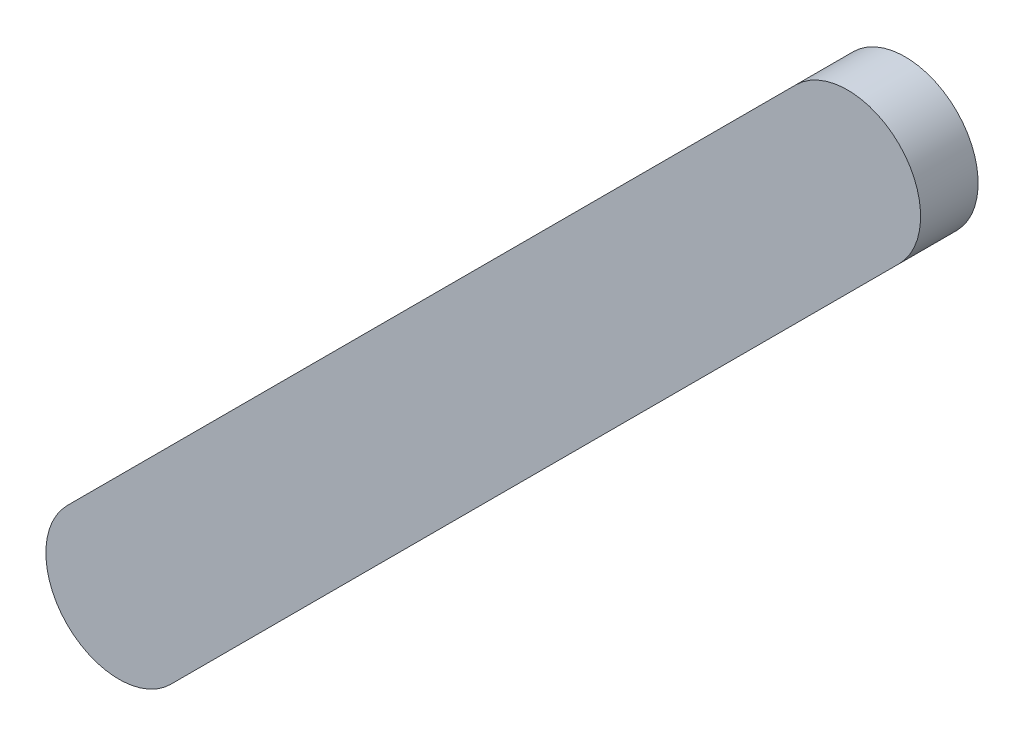
ISO-10303-21;
HEADER;
FILE_DESCRIPTION(('STEP AP214'),'2;1');
FILE_NAME('part.step','',(''),(''),'','','');
FILE_SCHEMA(('AUTOMOTIVE_DESIGN { 1 0 10303 214 1 1 1 1 }'));
ENDSEC;
DATA;
#1=APPLICATION_CONTEXT('core data for automotive mechanical design processes');
#2=APPLICATION_PROTOCOL_DEFINITION('international standard','automotive_design',2000,#1);
#3=PRODUCT_CONTEXT('',#1,'mechanical');
#4=PRODUCT('Part','Part','',(#3));
#5=PRODUCT_RELATED_PRODUCT_CATEGORY('part','',(#4));
#6=PRODUCT_DEFINITION_FORMATION('','',#4);
#7=PRODUCT_DEFINITION_CONTEXT('part definition',#1,'design');
#8=PRODUCT_DEFINITION('design','',#6,#7);
#9=PRODUCT_DEFINITION_SHAPE('','',#8);
#10=(LENGTH_UNIT() NAMED_UNIT(*) SI_UNIT(.MILLI.,.METRE.));
#11=(NAMED_UNIT(*) PLANE_ANGLE_UNIT() SI_UNIT($,.RADIAN.));
#12=(NAMED_UNIT(*) SI_UNIT($,.STERADIAN.) SOLID_ANGLE_UNIT());
#13=UNCERTAINTY_MEASURE_WITH_UNIT(LENGTH_MEASURE(1.E-05),#10,'distance_accuracy_value','');
#14=(GEOMETRIC_REPRESENTATION_CONTEXT(3) GLOBAL_UNCERTAINTY_ASSIGNED_CONTEXT((#13)) GLOBAL_UNIT_ASSIGNED_CONTEXT((#10,
#11,#12)) REPRESENTATION_CONTEXT('',''));
#15=CARTESIAN_POINT('',(0.,0.,0.));
#16=DIRECTION('',(0.,0.,1.));
#17=DIRECTION('',(1.,0.,0.));
#18=AXIS2_PLACEMENT_3D('',#15,#16,#17);
#19=CARTESIAN_POINT('',(135.89820674,61.39639486,0.));
#20=DIRECTION('',(-0.707106781186548,0.707106781186548,0.));
#21=DIRECTION('',(0.707106781186548,0.707106781186548,0.));
#22=AXIS2_PLACEMENT_3D('',#19,#20,#21);
#23=PLANE('',#22);
#24=DIRECTION('',(0.707106781186548,0.707106781186548,0.));
#25=VECTOR('',#24,1.);
#26=CARTESIAN_POINT('',(135.89820674,61.39639486,0.1999996));
#27=LINE('',#26,#25);
#28=CARTESIAN_POINT('',(135.89820674,61.39639486,0.1999996));
#29=VERTEX_POINT('',#28);
#30=CARTESIAN_POINT('',(138.43180594,63.92999406,0.1999996));
#31=VERTEX_POINT('',#30);
#32=EDGE_CURVE('E11',#29,#31,#27,.T.);
#33=ORIENTED_EDGE('',*,*,#32,.F.);
#34=DIRECTION('',(0.,0.,1.));
#35=VECTOR('',#34,1.);
#36=CARTESIAN_POINT('',(135.89820674,61.39639486,0.));
#37=LINE('',#36,#35);
#38=CARTESIAN_POINT('',(135.89820674,61.39639486,0.));
#39=VERTEX_POINT('',#38);
#40=EDGE_CURVE('E24',#39,#29,#37,.T.);
#41=ORIENTED_EDGE('',*,*,#40,.F.);
#42=DIRECTION('',(0.707106781186548,0.707106781186548,0.));
#43=VECTOR('',#42,1.);
#44=CARTESIAN_POINT('',(135.89820674,61.39639486,0.));
#45=LINE('',#44,#43);
#46=CARTESIAN_POINT('',(138.43180594,63.92999406,0.));
#47=VERTEX_POINT('',#46);
#48=EDGE_CURVE('E75',#39,#47,#45,.T.);
#49=ORIENTED_EDGE('',*,*,#48,.T.);
#50=DIRECTION('',(0.,0.,1.));
#51=VECTOR('',#50,1.);
#52=CARTESIAN_POINT('',(138.43180594,63.92999406,0.));
#53=LINE('',#52,#51);
#54=EDGE_CURVE('E37',#47,#31,#53,.T.);
#55=ORIENTED_EDGE('',*,*,#54,.T.);
#56=EDGE_LOOP('',(#33,#41,#49,#55));
#57=FACE_BOUND('',#56,.T.);
#58=ADVANCED_FACE('F17',(#57),#23,.F.);
#59=CARTESIAN_POINT('',(138.2522,64.1096,0.));
#60=DIRECTION('',(0.,0.,-1.));
#61=DIRECTION('',(0.707106781186576,-0.70710678118652,0.));
#62=AXIS2_PLACEMENT_3D('',#59,#60,#61);
#63=CYLINDRICAL_SURFACE('',#62,0.254001156230781);
#64=CARTESIAN_POINT('',(138.2522,64.1096,0.1999996));
#65=DIRECTION('',(0.,0.,1.));
#66=DIRECTION('',(0.707106781186576,-0.70710678118652,0.));
#67=AXIS2_PLACEMENT_3D('',#64,#65,#66);
#68=CIRCLE('',#67,0.254001156230781);
#69=CARTESIAN_POINT('',(138.07259406,64.28920594,0.1999996));
#70=VERTEX_POINT('',#69);
#71=EDGE_CURVE('E83',#31,#70,#68,.T.);
#72=ORIENTED_EDGE('',*,*,#71,.F.);
#73=ORIENTED_EDGE('',*,*,#54,.F.);
#74=CARTESIAN_POINT('',(138.2522,64.1096,0.));
#75=DIRECTION('',(0.,0.,1.));
#76=DIRECTION('',(0.707106781186576,-0.70710678118652,0.));
#77=AXIS2_PLACEMENT_3D('',#74,#75,#76);
#78=CIRCLE('',#77,0.254001156230781);
#79=CARTESIAN_POINT('',(138.07259406,64.28920594,0.));
#80=VERTEX_POINT('',#79);
#81=EDGE_CURVE('E81',#47,#80,#78,.T.);
#82=ORIENTED_EDGE('',*,*,#81,.T.);
#83=DIRECTION('',(0.,0.,1.));
#84=VECTOR('',#83,1.);
#85=CARTESIAN_POINT('',(138.07259406,64.28920594,0.));
#86=LINE('',#85,#84);
#87=EDGE_CURVE('E67',#80,#70,#86,.T.);
#88=ORIENTED_EDGE('',*,*,#87,.T.);
#89=EDGE_LOOP('',(#72,#73,#82,#88));
#90=FACE_BOUND('',#89,.T.);
#91=ADVANCED_FACE('F89',(#90),#63,.T.);
#92=CARTESIAN_POINT('',(138.07259406,64.28920594,0.));
#93=DIRECTION('',(0.707106781186553,-0.707106781186543,0.));
#94=DIRECTION('',(-0.707106781186543,-0.707106781186553,0.));
#95=AXIS2_PLACEMENT_3D('',#92,#93,#94);
#96=PLANE('',#95);
#97=DIRECTION('',(-0.707106781186543,-0.707106781186553,0.));
#98=VECTOR('',#97,1.);
#99=CARTESIAN_POINT('',(138.07259406,64.28920594,0.1999996));
#100=LINE('',#99,#98);
#101=CARTESIAN_POINT('',(135.53899486,61.75560674,0.1999996));
#102=VERTEX_POINT('',#101);
#103=EDGE_CURVE('E71',#70,#102,#100,.T.);
#104=ORIENTED_EDGE('',*,*,#103,.F.);
#105=ORIENTED_EDGE('',*,*,#87,.F.);
#106=DIRECTION('',(-0.707106781186543,-0.707106781186553,0.));
#107=VECTOR('',#106,1.);
#108=CARTESIAN_POINT('',(138.07259406,64.28920594,0.));
#109=LINE('',#108,#107);
#110=CARTESIAN_POINT('',(135.53899486,61.75560674,0.));
#111=VERTEX_POINT('',#110);
#112=EDGE_CURVE('E63',#80,#111,#109,.T.);
#113=ORIENTED_EDGE('',*,*,#112,.T.);
#114=DIRECTION('',(0.,0.,1.));
#115=VECTOR('',#114,1.);
#116=CARTESIAN_POINT('',(135.53899486,61.75560674,0.));
#117=LINE('',#116,#115);
#118=EDGE_CURVE('E53',#111,#102,#117,.T.);
#119=ORIENTED_EDGE('',*,*,#118,.T.);
#120=EDGE_LOOP('',(#104,#105,#113,#119));
#121=FACE_BOUND('',#120,.T.);
#122=ADVANCED_FACE('F66',(#121),#96,.F.);
#123=CARTESIAN_POINT('',(135.7186008,61.5760008,0.));
#124=DIRECTION('',(0.,0.,-1.));
#125=DIRECTION('',(-0.707106781186534,0.707106781186562,0.));
#126=AXIS2_PLACEMENT_3D('',#123,#124,#125);
#127=CYLINDRICAL_SURFACE('',#126,0.254001156230766);
#128=CARTESIAN_POINT('',(135.7186008,61.5760008,0.1999996));
#129=DIRECTION('',(0.,0.,1.));
#130=DIRECTION('',(-0.707106781186534,0.707106781186562,0.));
#131=AXIS2_PLACEMENT_3D('',#128,#129,#130);
#132=CIRCLE('',#131,0.254001156230766);
#133=EDGE_CURVE('E59',#102,#29,#132,.T.);
#134=ORIENTED_EDGE('',*,*,#133,.F.);
#135=ORIENTED_EDGE('',*,*,#118,.F.);
#136=CARTESIAN_POINT('',(135.7186008,61.5760008,0.));
#137=DIRECTION('',(0.,0.,1.));
#138=DIRECTION('',(-0.707106781186534,0.707106781186562,0.));
#139=AXIS2_PLACEMENT_3D('',#136,#137,#138);
#140=CIRCLE('',#139,0.254001156230766);
#141=EDGE_CURVE('E57',#111,#39,#140,.T.);
#142=ORIENTED_EDGE('',*,*,#141,.T.);
#143=ORIENTED_EDGE('',*,*,#40,.T.);
#144=EDGE_LOOP('',(#134,#135,#142,#143));
#145=FACE_BOUND('',#144,.T.);
#146=ADVANCED_FACE('F55',(#145),#127,.T.);
#147=CARTESIAN_POINT('',(135.89820674,61.39639486,0.));
#148=DIRECTION('',(0.,0.,-1.));
#149=DIRECTION('',(-1.,0.,0.));
#150=AXIS2_PLACEMENT_3D('',#147,#148,#149);
#151=PLANE('',#150);
#152=ORIENTED_EDGE('',*,*,#141,.F.);
#153=ORIENTED_EDGE('',*,*,#112,.F.);
#154=ORIENTED_EDGE('',*,*,#81,.F.);
#155=ORIENTED_EDGE('',*,*,#48,.F.);
#156=EDGE_LOOP('',(#152,#153,#154,#155));
#157=FACE_BOUND('',#156,.T.);
#158=ADVANCED_FACE('F74',(#157),#151,.T.);
#159=CARTESIAN_POINT('',(135.89820674,61.39639486,0.1999996));
#160=DIRECTION('',(0.,0.,-1.));
#161=DIRECTION('',(-1.,0.,0.));
#162=AXIS2_PLACEMENT_3D('',#159,#160,#161);
#163=PLANE('',#162);
#164=ORIENTED_EDGE('',*,*,#32,.T.);
#165=ORIENTED_EDGE('',*,*,#71,.T.);
#166=ORIENTED_EDGE('',*,*,#103,.T.);
#167=ORIENTED_EDGE('',*,*,#133,.T.);
#168=EDGE_LOOP('',(#164,#165,#166,#167));
#169=FACE_BOUND('',#168,.T.);
#170=ADVANCED_FACE('F91',(#169),#163,.F.);
#171=CLOSED_SHELL('',(#58,#91,#122,#146,#158,#170));
#172=MANIFOLD_SOLID_BREP('B1',#171);
#173=ADVANCED_BREP_SHAPE_REPRESENTATION('',(#18,#172),#14);
#174=SHAPE_DEFINITION_REPRESENTATION(#9,#173);
ENDSEC;
END-ISO-10303-21;
